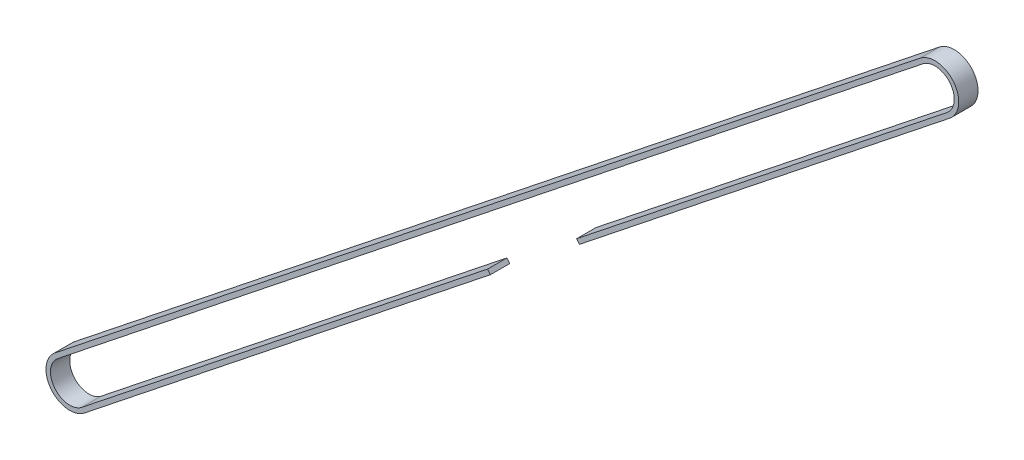
ISO-10303-21;
HEADER;
FILE_DESCRIPTION(('STEP AP214'),'2;1');
FILE_NAME('part.step','',(''),(''),'','','');
FILE_SCHEMA(('AUTOMOTIVE_DESIGN { 1 0 10303 214 1 1 1 1 }'));
ENDSEC;
DATA;
#1=APPLICATION_CONTEXT('core data for automotive mechanical design processes');
#2=APPLICATION_PROTOCOL_DEFINITION('international standard','automotive_design',2000,#1);
#3=PRODUCT_CONTEXT('',#1,'mechanical');
#4=PRODUCT('Part','Part','',(#3));
#5=PRODUCT_RELATED_PRODUCT_CATEGORY('part','',(#4));
#6=PRODUCT_DEFINITION_FORMATION('','',#4);
#7=PRODUCT_DEFINITION_CONTEXT('part definition',#1,'design');
#8=PRODUCT_DEFINITION('design','',#6,#7);
#9=PRODUCT_DEFINITION_SHAPE('','',#8);
#10=(LENGTH_UNIT() NAMED_UNIT(*) SI_UNIT(.MILLI.,.METRE.));
#11=(NAMED_UNIT(*) PLANE_ANGLE_UNIT() SI_UNIT($,.RADIAN.));
#12=(NAMED_UNIT(*) SI_UNIT($,.STERADIAN.) SOLID_ANGLE_UNIT());
#13=UNCERTAINTY_MEASURE_WITH_UNIT(LENGTH_MEASURE(1.E-05),#10,'distance_accuracy_value','');
#14=(GEOMETRIC_REPRESENTATION_CONTEXT(3) GLOBAL_UNCERTAINTY_ASSIGNED_CONTEXT((#13)) GLOBAL_UNIT_ASSIGNED_CONTEXT((#10,
#11,#12)) REPRESENTATION_CONTEXT('',''));
#15=CARTESIAN_POINT('',(0.,0.,0.));
#16=DIRECTION('',(0.,0.,1.));
#17=DIRECTION('',(1.,0.,0.));
#18=AXIS2_PLACEMENT_3D('',#15,#16,#17);
#19=CARTESIAN_POINT('',(269.180159552767,214.018546135803,6.));
#20=DIRECTION('',(0.,0.,-1.));
#21=DIRECTION('',(-1.,0.,0.));
#22=AXIS2_PLACEMENT_3D('',#19,#20,#21);
#23=CYLINDRICAL_SURFACE('',#22,5.99999999999987);
#24=CARTESIAN_POINT('',(269.180159552767,214.018546135803,0.));
#25=DIRECTION('',(0.,0.,1.));
#26=DIRECTION('',(1.,0.,0.));
#27=AXIS2_PLACEMENT_3D('',#24,#25,#26);
#28=CIRCLE('',#27,5.99999999999987);
#29=CARTESIAN_POINT('',(272.914210511262,209.32207262482,0.));
#30=VERTEX_POINT('',#29);
#31=CARTESIAN_POINT('',(265.446108594273,218.715019646785,0.));
#32=VERTEX_POINT('',#31);
#33=EDGE_CURVE('E154',#30,#32,#28,.T.);
#34=ORIENTED_EDGE('',*,*,#33,.F.);
#35=DIRECTION('',(0.,0.,-1.));
#36=VECTOR('',#35,1.);
#37=CARTESIAN_POINT('',(272.914210511262,209.32207262482,6.));
#38=LINE('',#37,#36);
#39=CARTESIAN_POINT('',(272.914210511262,209.32207262482,6.));
#40=VERTEX_POINT('',#39);
#41=EDGE_CURVE('E11',#40,#30,#38,.T.);
#42=ORIENTED_EDGE('',*,*,#41,.F.);
#43=CARTESIAN_POINT('',(269.180159552767,214.018546135803,6.));
#44=DIRECTION('',(0.,0.,1.));
#45=DIRECTION('',(1.,0.,0.));
#46=AXIS2_PLACEMENT_3D('',#43,#44,#45);
#47=CIRCLE('',#46,5.99999999999987);
#48=CARTESIAN_POINT('',(265.446108594273,218.715019646785,6.));
#49=VERTEX_POINT('',#48);
#50=EDGE_CURVE('E186',#40,#49,#47,.T.);
#51=ORIENTED_EDGE('',*,*,#50,.T.);
#52=DIRECTION('',(0.,0.,-1.));
#53=VECTOR('',#52,1.);
#54=CARTESIAN_POINT('',(265.446108594273,218.715019646785,6.));
#55=LINE('',#54,#53);
#56=EDGE_CURVE('E36',#49,#32,#55,.T.);
#57=ORIENTED_EDGE('',*,*,#56,.T.);
#58=EDGE_LOOP('',(#34,#42,#51,#57));
#59=FACE_BOUND('',#58,.T.);
#60=ADVANCED_FACE('F33',(#59),#23,.F.);
#61=CARTESIAN_POINT('',(157.679515420535,117.701791439551,6.));
#62=DIRECTION('',(-0.622341826415828,0.782745585163795,0.));
#63=DIRECTION('',(-0.782745585163795,-0.622341826415828,0.));
#64=AXIS2_PLACEMENT_3D('',#61,#62,#63);
#65=PLANE('',#64);
#66=DIRECTION('',(0.782745585163795,0.622341826415828,0.));
#67=VECTOR('',#66,1.);
#68=CARTESIAN_POINT('',(157.679515420535,117.701791439551,0.));
#69=LINE('',#68,#67);
#70=CARTESIAN_POINT('',(157.679515420535,117.701791439551,0.));
#71=VERTEX_POINT('',#70);
#72=EDGE_CURVE('E184',#71,#30,#69,.T.);
#73=ORIENTED_EDGE('',*,*,#72,.F.);
#74=DIRECTION('',(0.,0.,-1.));
#75=VECTOR('',#74,1.);
#76=CARTESIAN_POINT('',(157.679515420535,117.701791439551,6.));
#77=LINE('',#76,#75);
#78=CARTESIAN_POINT('',(157.679515420535,117.701791439551,6.));
#79=VERTEX_POINT('',#78);
#80=EDGE_CURVE('E42',#79,#71,#77,.T.);
#81=ORIENTED_EDGE('',*,*,#80,.F.);
#82=DIRECTION('',(0.782745585163795,0.622341826415828,0.));
#83=VECTOR('',#82,1.);
#84=CARTESIAN_POINT('',(157.679515420535,117.701791439551,6.));
#85=LINE('',#84,#83);
#86=EDGE_CURVE('E144',#79,#40,#85,.T.);
#87=ORIENTED_EDGE('',*,*,#86,.T.);
#88=ORIENTED_EDGE('',*,*,#41,.T.);
#89=EDGE_LOOP('',(#73,#81,#87,#88));
#90=FACE_BOUND('',#89,.T.);
#91=ADVANCED_FACE('F206',(#90),#65,.T.);
#92=CARTESIAN_POINT('',(158.550793977517,116.605947620322,6.));
#93=DIRECTION('',(-0.782745585163794,-0.622341826415829,0.));
#94=DIRECTION('',(0.622341826415829,-0.782745585163794,0.));
#95=AXIS2_PLACEMENT_3D('',#92,#93,#94);
#96=PLANE('',#95);
#97=DIRECTION('',(-0.622341826415829,0.782745585163794,0.));
#98=VECTOR('',#97,1.);
#99=CARTESIAN_POINT('',(158.550793977517,116.605947620322,0.));
#100=LINE('',#99,#98);
#101=CARTESIAN_POINT('',(158.550793977517,116.605947620322,0.));
#102=VERTEX_POINT('',#101);
#103=EDGE_CURVE('E131',#102,#71,#100,.T.);
#104=ORIENTED_EDGE('',*,*,#103,.F.);
#105=DIRECTION('',(0.,0.,-1.));
#106=VECTOR('',#105,1.);
#107=CARTESIAN_POINT('',(158.550793977517,116.605947620322,6.));
#108=LINE('',#107,#106);
#109=CARTESIAN_POINT('',(158.550793977517,116.605947620322,6.));
#110=VERTEX_POINT('',#109);
#111=EDGE_CURVE('E126',#110,#102,#108,.T.);
#112=ORIENTED_EDGE('',*,*,#111,.F.);
#113=DIRECTION('',(-0.622341826415829,0.782745585163794,0.));
#114=VECTOR('',#113,1.);
#115=CARTESIAN_POINT('',(158.550793977517,116.605947620322,6.));
#116=LINE('',#115,#114);
#117=EDGE_CURVE('E129',#110,#79,#116,.T.);
#118=ORIENTED_EDGE('',*,*,#117,.T.);
#119=ORIENTED_EDGE('',*,*,#80,.T.);
#120=EDGE_LOOP('',(#104,#112,#118,#119));
#121=FACE_BOUND('',#120,.T.);
#122=ADVANCED_FACE('F128',(#121),#96,.T.);
#123=CARTESIAN_POINT('',(273.785489068244,208.226228805591,6.));
#124=DIRECTION('',(0.622341826415829,-0.782745585163794,0.));
#125=DIRECTION('',(0.782745585163794,0.622341826415829,0.));
#126=AXIS2_PLACEMENT_3D('',#123,#124,#125);
#127=PLANE('',#126);
#128=DIRECTION('',(-0.782745585163794,-0.622341826415829,0.));
#129=VECTOR('',#128,1.);
#130=CARTESIAN_POINT('',(273.785489068244,208.226228805591,0.));
#131=LINE('',#130,#129);
#132=CARTESIAN_POINT('',(273.785489068245,208.226228805591,0.));
#133=VERTEX_POINT('',#132);
#134=EDGE_CURVE('E181',#133,#102,#131,.T.);
#135=ORIENTED_EDGE('',*,*,#134,.F.);
#136=DIRECTION('',(0.,0.,-1.));
#137=VECTOR('',#136,1.);
#138=CARTESIAN_POINT('',(273.785489068245,208.226228805591,6.));
#139=LINE('',#138,#137);
#140=CARTESIAN_POINT('',(273.785489068245,208.226228805591,6.));
#141=VERTEX_POINT('',#140);
#142=EDGE_CURVE('E136',#141,#133,#139,.T.);
#143=ORIENTED_EDGE('',*,*,#142,.F.);
#144=DIRECTION('',(-0.782745585163794,-0.622341826415829,0.));
#145=VECTOR('',#144,1.);
#146=CARTESIAN_POINT('',(273.785489068244,208.226228805591,6.));
#147=LINE('',#146,#145);
#148=EDGE_CURVE('E142',#141,#110,#147,.T.);
#149=ORIENTED_EDGE('',*,*,#148,.T.);
#150=ORIENTED_EDGE('',*,*,#111,.T.);
#151=EDGE_LOOP('',(#135,#143,#149,#150));
#152=FACE_BOUND('',#151,.T.);
#153=ADVANCED_FACE('F146',(#152),#127,.T.);
#154=CARTESIAN_POINT('',(269.180159552767,214.018546135803,6.));
#155=DIRECTION('',(0.,0.,-1.));
#156=DIRECTION('',(-1.,0.,0.));
#157=AXIS2_PLACEMENT_3D('',#154,#155,#156);
#158=CYLINDRICAL_SURFACE('',#157,7.39999999999992);
#159=CARTESIAN_POINT('',(269.180159552767,214.018546135803,0.));
#160=DIRECTION('',(0.,0.,-1.));
#161=DIRECTION('',(-1.,0.,0.));
#162=AXIS2_PLACEMENT_3D('',#159,#160,#161);
#163=CIRCLE('',#162,7.39999999999992);
#164=CARTESIAN_POINT('',(264.57483003729,219.810863466015,0.));
#165=VERTEX_POINT('',#164);
#166=EDGE_CURVE('E178',#165,#133,#163,.T.);
#167=ORIENTED_EDGE('',*,*,#166,.F.);
#168=DIRECTION('',(0.,0.,-1.));
#169=VECTOR('',#168,1.);
#170=CARTESIAN_POINT('',(264.57483003729,219.810863466015,6.));
#171=LINE('',#170,#169);
#172=CARTESIAN_POINT('',(264.57483003729,219.810863466015,6.));
#173=VERTEX_POINT('',#172);
#174=EDGE_CURVE('E190',#173,#165,#171,.T.);
#175=ORIENTED_EDGE('',*,*,#174,.F.);
#176=CARTESIAN_POINT('',(269.180159552767,214.018546135803,6.));
#177=DIRECTION('',(0.,0.,-1.));
#178=DIRECTION('',(-1.,0.,0.));
#179=AXIS2_PLACEMENT_3D('',#176,#177,#178);
#180=CIRCLE('',#179,7.39999999999992);
#181=EDGE_CURVE('E147',#173,#141,#180,.T.);
#182=ORIENTED_EDGE('',*,*,#181,.T.);
#183=ORIENTED_EDGE('',*,*,#142,.T.);
#184=EDGE_LOOP('',(#167,#175,#182,#183));
#185=FACE_BOUND('',#184,.T.);
#186=ADVANCED_FACE('F219',(#185),#158,.T.);
#187=CARTESIAN_POINT('',(-4.60532951547714,5.79231733021209,6.));
#188=DIRECTION('',(-0.622341826415829,0.782745585163794,0.));
#189=DIRECTION('',(-0.782745585163794,-0.622341826415829,0.));
#190=AXIS2_PLACEMENT_3D('',#187,#188,#189);
#191=PLANE('',#190);
#192=DIRECTION('',(0.782745585163794,0.622341826415829,0.));
#193=VECTOR('',#192,1.);
#194=CARTESIAN_POINT('',(-4.60532951547714,5.79231733021209,0.));
#195=LINE('',#194,#193);
#196=CARTESIAN_POINT('',(-4.60532951547713,5.79231733021209,0.));
#197=VERTEX_POINT('',#196);
#198=EDGE_CURVE('E175',#197,#165,#195,.T.);
#199=ORIENTED_EDGE('',*,*,#198,.F.);
#200=DIRECTION('',(0.,0.,-1.));
#201=VECTOR('',#200,1.);
#202=CARTESIAN_POINT('',(-4.60532951547713,5.79231733021209,6.));
#203=LINE('',#202,#201);
#204=CARTESIAN_POINT('',(-4.60532951547713,5.79231733021209,6.));
#205=VERTEX_POINT('',#204);
#206=EDGE_CURVE('E192',#205,#197,#203,.T.);
#207=ORIENTED_EDGE('',*,*,#206,.F.);
#208=DIRECTION('',(0.782745585163794,0.622341826415829,0.));
#209=VECTOR('',#208,1.);
#210=CARTESIAN_POINT('',(-4.60532951547714,5.79231733021209,6.));
#211=LINE('',#210,#209);
#212=EDGE_CURVE('E149',#205,#173,#211,.T.);
#213=ORIENTED_EDGE('',*,*,#212,.T.);
#214=ORIENTED_EDGE('',*,*,#174,.T.);
#215=EDGE_LOOP('',(#199,#207,#213,#214));
#216=FACE_BOUND('',#215,.T.);
#217=ADVANCED_FACE('F222',(#216),#191,.T.);
#218=CARTESIAN_POINT('',(0.,0.,6.));
#219=DIRECTION('',(0.,0.,-1.));
#220=DIRECTION('',(-1.,0.,0.));
#221=AXIS2_PLACEMENT_3D('',#218,#219,#220);
#222=CYLINDRICAL_SURFACE('',#221,7.40000000000001);
#223=CARTESIAN_POINT('',(0.,0.,0.));
#224=DIRECTION('',(0.,0.,-1.));
#225=DIRECTION('',(-1.,0.,0.));
#226=AXIS2_PLACEMENT_3D('',#223,#224,#225);
#227=CIRCLE('',#226,7.40000000000001);
#228=CARTESIAN_POINT('',(4.60532951547712,-5.79231733021209,0.));
#229=VERTEX_POINT('',#228);
#230=EDGE_CURVE('E172',#229,#197,#227,.T.);
#231=ORIENTED_EDGE('',*,*,#230,.F.);
#232=DIRECTION('',(0.,0.,-1.));
#233=VECTOR('',#232,1.);
#234=CARTESIAN_POINT('',(4.60532951547712,-5.79231733021209,6.));
#235=LINE('',#234,#233);
#236=CARTESIAN_POINT('',(4.60532951547712,-5.79231733021209,6.));
#237=VERTEX_POINT('',#236);
#238=EDGE_CURVE('E194',#237,#229,#235,.T.);
#239=ORIENTED_EDGE('',*,*,#238,.F.);
#240=CARTESIAN_POINT('',(0.,0.,6.));
#241=DIRECTION('',(0.,0.,-1.));
#242=DIRECTION('',(-1.,0.,0.));
#243=AXIS2_PLACEMENT_3D('',#240,#241,#242);
#244=CIRCLE('',#243,7.40000000000001);
#245=EDGE_CURVE('E354',#237,#205,#244,.T.);
#246=ORIENTED_EDGE('',*,*,#245,.T.);
#247=ORIENTED_EDGE('',*,*,#206,.T.);
#248=EDGE_LOOP('',(#231,#239,#246,#247));
#249=FACE_BOUND('',#248,.T.);
#250=ADVANCED_FACE('F226',(#249),#222,.T.);
#251=CARTESIAN_POINT('',(130.871278556982,94.5986434494323,6.));
#252=DIRECTION('',(0.622341826415829,-0.782745585163794,0.));
#253=DIRECTION('',(0.782745585163794,0.622341826415829,0.));
#254=AXIS2_PLACEMENT_3D('',#251,#252,#253);
#255=PLANE('',#254);
#256=DIRECTION('',(-0.782745585163794,-0.622341826415829,0.));
#257=VECTOR('',#256,1.);
#258=CARTESIAN_POINT('',(130.871278556982,94.5986434494323,0.));
#259=LINE('',#258,#257);
#260=CARTESIAN_POINT('',(130.871278556982,94.5986434494323,0.));
#261=VERTEX_POINT('',#260);
#262=EDGE_CURVE('E169',#261,#229,#259,.T.);
#263=ORIENTED_EDGE('',*,*,#262,.F.);
#264=DIRECTION('',(0.,0.,-1.));
#265=VECTOR('',#264,1.);
#266=CARTESIAN_POINT('',(130.871278556982,94.5986434494323,6.));
#267=LINE('',#266,#265);
#268=CARTESIAN_POINT('',(130.871278556982,94.5986434494323,6.));
#269=VERTEX_POINT('',#268);
#270=EDGE_CURVE('E196',#269,#261,#267,.T.);
#271=ORIENTED_EDGE('',*,*,#270,.F.);
#272=DIRECTION('',(-0.782745585163794,-0.622341826415829,0.));
#273=VECTOR('',#272,1.);
#274=CARTESIAN_POINT('',(130.871278556982,94.5986434494323,6.));
#275=LINE('',#274,#273);
#276=EDGE_CURVE('E358',#269,#237,#275,.T.);
#277=ORIENTED_EDGE('',*,*,#276,.T.);
#278=ORIENTED_EDGE('',*,*,#238,.T.);
#279=EDGE_LOOP('',(#263,#271,#277,#278));
#280=FACE_BOUND('',#279,.T.);
#281=ADVANCED_FACE('F230',(#280),#255,.T.);
#282=CARTESIAN_POINT('',(130.871278556982,94.5986434494323,6.));
#283=DIRECTION('',(0.782745585163796,0.622341826415827,0.));
#284=DIRECTION('',(-0.622341826415827,0.782745585163796,0.));
#285=AXIS2_PLACEMENT_3D('',#282,#283,#284);
#286=PLANE('',#285);
#287=DIRECTION('',(0.622341826415826,-0.782745585163796,0.));
#288=VECTOR('',#287,1.);
#289=CARTESIAN_POINT('',(130.871278556982,94.5986434494323,0.));
#290=LINE('',#289,#288);
#291=CARTESIAN_POINT('',(130.,95.6944872686616,0.));
#292=VERTEX_POINT('',#291);
#293=EDGE_CURVE('E166',#292,#261,#290,.T.);
#294=ORIENTED_EDGE('',*,*,#293,.F.);
#295=DIRECTION('',(0.,0.,-1.));
#296=VECTOR('',#295,1.);
#297=CARTESIAN_POINT('',(130.,95.6944872686616,6.));
#298=LINE('',#297,#296);
#299=CARTESIAN_POINT('',(130.,95.6944872686616,6.));
#300=VERTEX_POINT('',#299);
#301=EDGE_CURVE('E198',#300,#292,#298,.T.);
#302=ORIENTED_EDGE('',*,*,#301,.F.);
#303=DIRECTION('',(0.622341826415826,-0.782745585163796,0.));
#304=VECTOR('',#303,1.);
#305=CARTESIAN_POINT('',(130.871278556982,94.5986434494323,6.));
#306=LINE('',#305,#304);
#307=EDGE_CURVE('E347',#300,#269,#306,.T.);
#308=ORIENTED_EDGE('',*,*,#307,.T.);
#309=ORIENTED_EDGE('',*,*,#270,.T.);
#310=EDGE_LOOP('',(#294,#302,#308,#309));
#311=FACE_BOUND('',#310,.T.);
#312=ADVANCED_FACE('F234',(#311),#286,.T.);
#313=CARTESIAN_POINT('',(3.73405095849498,-4.69647351098279,6.));
#314=DIRECTION('',(-0.622341826415829,0.782745585163794,0.));
#315=DIRECTION('',(-0.782745585163794,-0.622341826415829,0.));
#316=AXIS2_PLACEMENT_3D('',#313,#314,#315);
#317=PLANE('',#316);
#318=DIRECTION('',(0.782745585163794,0.622341826415829,0.));
#319=VECTOR('',#318,1.);
#320=CARTESIAN_POINT('',(3.73405095849498,-4.69647351098279,0.));
#321=LINE('',#320,#319);
#322=CARTESIAN_POINT('',(3.73405095849497,-4.69647351098279,0.));
#323=VERTEX_POINT('',#322);
#324=EDGE_CURVE('E163',#323,#292,#321,.T.);
#325=ORIENTED_EDGE('',*,*,#324,.F.);
#326=DIRECTION('',(0.,0.,-1.));
#327=VECTOR('',#326,1.);
#328=CARTESIAN_POINT('',(3.73405095849497,-4.69647351098279,6.));
#329=LINE('',#328,#327);
#330=CARTESIAN_POINT('',(3.73405095849497,-4.69647351098279,6.));
#331=VERTEX_POINT('',#330);
#332=EDGE_CURVE('E200',#331,#323,#329,.T.);
#333=ORIENTED_EDGE('',*,*,#332,.F.);
#334=DIRECTION('',(0.782745585163794,0.622341826415829,0.));
#335=VECTOR('',#334,1.);
#336=CARTESIAN_POINT('',(3.73405095849498,-4.69647351098279,6.));
#337=LINE('',#336,#335);
#338=EDGE_CURVE('E343',#331,#300,#337,.T.);
#339=ORIENTED_EDGE('',*,*,#338,.T.);
#340=ORIENTED_EDGE('',*,*,#301,.T.);
#341=EDGE_LOOP('',(#325,#333,#339,#340));
#342=FACE_BOUND('',#341,.T.);
#343=ADVANCED_FACE('F238',(#342),#317,.T.);
#344=CARTESIAN_POINT('',(0.,0.,6.));
#345=DIRECTION('',(0.,0.,-1.));
#346=DIRECTION('',(-1.,0.,0.));
#347=AXIS2_PLACEMENT_3D('',#344,#345,#346);
#348=CYLINDRICAL_SURFACE('',#347,6.00000000000002);
#349=CARTESIAN_POINT('',(0.,0.,0.));
#350=DIRECTION('',(0.,0.,1.));
#351=DIRECTION('',(1.,0.,0.));
#352=AXIS2_PLACEMENT_3D('',#349,#350,#351);
#353=CIRCLE('',#352,6.00000000000002);
#354=CARTESIAN_POINT('',(-3.73405095849498,4.69647351098278,0.));
#355=VERTEX_POINT('',#354);
#356=EDGE_CURVE('E160',#355,#323,#353,.T.);
#357=ORIENTED_EDGE('',*,*,#356,.F.);
#358=DIRECTION('',(0.,0.,-1.));
#359=VECTOR('',#358,1.);
#360=CARTESIAN_POINT('',(-3.73405095849498,4.69647351098278,6.));
#361=LINE('',#360,#359);
#362=CARTESIAN_POINT('',(-3.73405095849498,4.69647351098278,6.));
#363=VERTEX_POINT('',#362);
#364=EDGE_CURVE('E201',#363,#355,#361,.T.);
#365=ORIENTED_EDGE('',*,*,#364,.F.);
#366=CARTESIAN_POINT('',(0.,0.,6.));
#367=DIRECTION('',(0.,0.,1.));
#368=DIRECTION('',(1.,0.,0.));
#369=AXIS2_PLACEMENT_3D('',#366,#367,#368);
#370=CIRCLE('',#369,6.00000000000002);
#371=EDGE_CURVE('E364',#363,#331,#370,.T.);
#372=ORIENTED_EDGE('',*,*,#371,.T.);
#373=ORIENTED_EDGE('',*,*,#332,.T.);
#374=EDGE_LOOP('',(#357,#365,#372,#373));
#375=FACE_BOUND('',#374,.T.);
#376=ADVANCED_FACE('F242',(#375),#348,.F.);
#377=CARTESIAN_POINT('',(265.446108594273,218.715019646785,6.));
#378=DIRECTION('',(0.622341826415828,-0.782745585163795,0.));
#379=DIRECTION('',(0.782745585163795,0.622341826415828,0.));
#380=AXIS2_PLACEMENT_3D('',#377,#378,#379);
#381=PLANE('',#380);
#382=DIRECTION('',(-0.782745585163795,-0.622341826415828,0.));
#383=VECTOR('',#382,1.);
#384=CARTESIAN_POINT('',(265.446108594273,218.715019646785,0.));
#385=LINE('',#384,#383);
#386=EDGE_CURVE('E157',#32,#355,#385,.T.);
#387=ORIENTED_EDGE('',*,*,#386,.F.);
#388=ORIENTED_EDGE('',*,*,#56,.F.);
#389=DIRECTION('',(-0.782745585163795,-0.622341826415828,0.));
#390=VECTOR('',#389,1.);
#391=CARTESIAN_POINT('',(265.446108594273,218.715019646785,6.));
#392=LINE('',#391,#390);
#393=EDGE_CURVE('E366',#49,#363,#392,.T.);
#394=ORIENTED_EDGE('',*,*,#393,.T.);
#395=ORIENTED_EDGE('',*,*,#364,.T.);
#396=EDGE_LOOP('',(#387,#388,#394,#395));
#397=FACE_BOUND('',#396,.T.);
#398=ADVANCED_FACE('F203',(#397),#381,.T.);
#399=CARTESIAN_POINT('',(269.180159552767,214.018546135803,6.));
#400=DIRECTION('',(0.,0.,1.));
#401=DIRECTION('',(1.,0.,0.));
#402=AXIS2_PLACEMENT_3D('',#399,#400,#401);
#403=PLANE('',#402);
#404=ORIENTED_EDGE('',*,*,#50,.F.);
#405=ORIENTED_EDGE('',*,*,#86,.F.);
#406=ORIENTED_EDGE('',*,*,#117,.F.);
#407=ORIENTED_EDGE('',*,*,#148,.F.);
#408=ORIENTED_EDGE('',*,*,#181,.F.);
#409=ORIENTED_EDGE('',*,*,#212,.F.);
#410=ORIENTED_EDGE('',*,*,#245,.F.);
#411=ORIENTED_EDGE('',*,*,#276,.F.);
#412=ORIENTED_EDGE('',*,*,#307,.F.);
#413=ORIENTED_EDGE('',*,*,#338,.F.);
#414=ORIENTED_EDGE('',*,*,#371,.F.);
#415=ORIENTED_EDGE('',*,*,#393,.F.);
#416=EDGE_LOOP('',(#404,#405,#406,#407,#408,#409,#410,#411,#412,#413,#414,#415));
#417=FACE_BOUND('',#416,.T.);
#418=ADVANCED_FACE('F140',(#417),#403,.T.);
#419=CARTESIAN_POINT('',(269.180159552767,214.018546135803,0.));
#420=DIRECTION('',(0.,0.,1.));
#421=DIRECTION('',(1.,0.,0.));
#422=AXIS2_PLACEMENT_3D('',#419,#420,#421);
#423=PLANE('',#422);
#424=ORIENTED_EDGE('',*,*,#33,.T.);
#425=ORIENTED_EDGE('',*,*,#386,.T.);
#426=ORIENTED_EDGE('',*,*,#356,.T.);
#427=ORIENTED_EDGE('',*,*,#324,.T.);
#428=ORIENTED_EDGE('',*,*,#293,.T.);
#429=ORIENTED_EDGE('',*,*,#262,.T.);
#430=ORIENTED_EDGE('',*,*,#230,.T.);
#431=ORIENTED_EDGE('',*,*,#198,.T.);
#432=ORIENTED_EDGE('',*,*,#166,.T.);
#433=ORIENTED_EDGE('',*,*,#134,.T.);
#434=ORIENTED_EDGE('',*,*,#103,.T.);
#435=ORIENTED_EDGE('',*,*,#72,.T.);
#436=EDGE_LOOP('',(#424,#425,#426,#427,#428,#429,#430,#431,#432,#433,#434,#435));
#437=FACE_BOUND('',#436,.T.);
#438=ADVANCED_FACE('F205',(#437),#423,.F.);
#439=CLOSED_SHELL('',(#60,#91,#122,#153,#186,#217,#250,#281,#312,#343,#376,#398,#418,#438));
#440=MANIFOLD_SOLID_BREP('B2',#439);
#441=ADVANCED_BREP_SHAPE_REPRESENTATION('',(#18,#440),#14);
#442=SHAPE_DEFINITION_REPRESENTATION(#9,#441);
ENDSEC;
END-ISO-10303-21;
